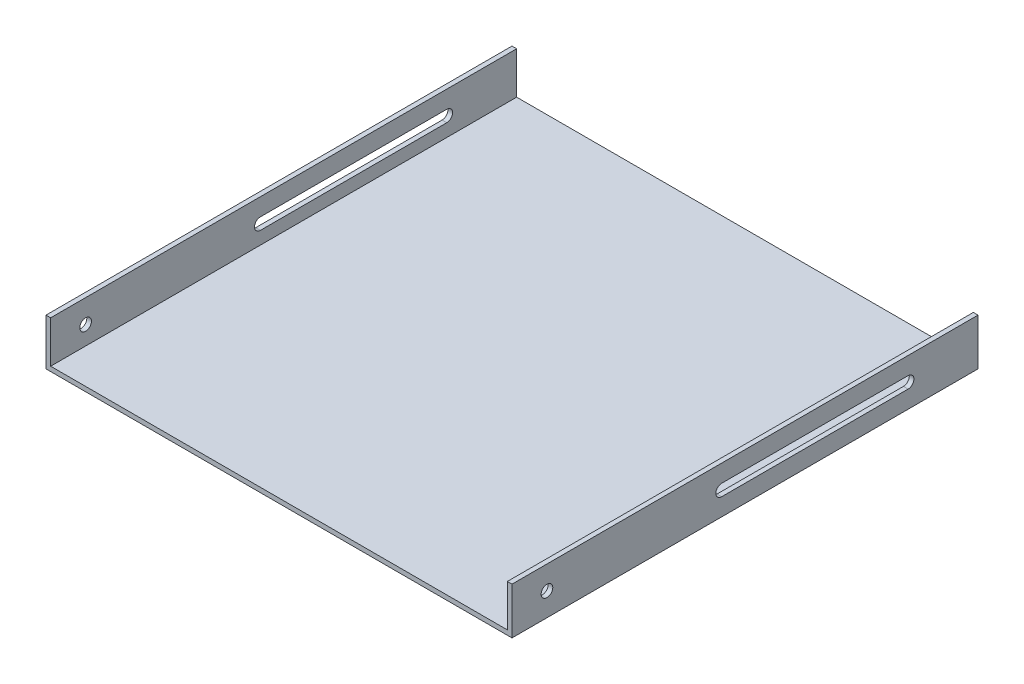
ISO-10303-21;
HEADER;
FILE_DESCRIPTION(('STEP AP214'),'2;1');
FILE_NAME('part.step','',(''),(''),'','','');
FILE_SCHEMA(('AUTOMOTIVE_DESIGN { 1 0 10303 214 1 1 1 1 }'));
ENDSEC;
DATA;
#1=APPLICATION_CONTEXT('core data for automotive mechanical design processes');
#2=APPLICATION_PROTOCOL_DEFINITION('international standard','automotive_design',2000,#1);
#3=PRODUCT_CONTEXT('',#1,'mechanical');
#4=PRODUCT('Part','Part','',(#3));
#5=PRODUCT_RELATED_PRODUCT_CATEGORY('part','',(#4));
#6=PRODUCT_DEFINITION_FORMATION('','',#4);
#7=PRODUCT_DEFINITION_CONTEXT('part definition',#1,'design');
#8=PRODUCT_DEFINITION('design','',#6,#7);
#9=PRODUCT_DEFINITION_SHAPE('','',#8);
#10=(LENGTH_UNIT() NAMED_UNIT(*) SI_UNIT(.MILLI.,.METRE.));
#11=(NAMED_UNIT(*) PLANE_ANGLE_UNIT() SI_UNIT($,.RADIAN.));
#12=(NAMED_UNIT(*) SI_UNIT($,.STERADIAN.) SOLID_ANGLE_UNIT());
#13=UNCERTAINTY_MEASURE_WITH_UNIT(LENGTH_MEASURE(1.E-05),#10,'distance_accuracy_value','');
#14=(GEOMETRIC_REPRESENTATION_CONTEXT(3) GLOBAL_UNCERTAINTY_ASSIGNED_CONTEXT((#13)) GLOBAL_UNIT_ASSIGNED_CONTEXT((#10,
#11,#12)) REPRESENTATION_CONTEXT('',''));
#15=CARTESIAN_POINT('',(0.,0.,0.));
#16=DIRECTION('',(0.,0.,1.));
#17=DIRECTION('',(1.,0.,0.));
#18=AXIS2_PLACEMENT_3D('',#15,#16,#17);
#19=CARTESIAN_POINT('',(2.,20.,100.));
#20=DIRECTION('',(0.,-1.,0.));
#21=DIRECTION('',(0.,0.,-1.));
#22=AXIS2_PLACEMENT_3D('',#19,#20,#21);
#23=PLANE('',#22);
#24=DIRECTION('',(-1.,0.,0.));
#25=VECTOR('',#24,1.);
#26=CARTESIAN_POINT('',(2.,20.,-100.));
#27=LINE('',#26,#25);
#28=CARTESIAN_POINT('',(2.,20.,-100.));
#29=VERTEX_POINT('',#28);
#30=CARTESIAN_POINT('',(0.,20.,-100.));
#31=VERTEX_POINT('',#30);
#32=EDGE_CURVE('E235',#29,#31,#27,.T.);
#33=ORIENTED_EDGE('',*,*,#32,.T.);
#34=DIRECTION('',(0.,0.,-1.));
#35=VECTOR('',#34,1.);
#36=CARTESIAN_POINT('',(0.,20.,100.));
#37=LINE('',#36,#35);
#38=CARTESIAN_POINT('',(0.,20.,100.));
#39=VERTEX_POINT('',#38);
#40=EDGE_CURVE('E313',#39,#31,#37,.T.);
#41=ORIENTED_EDGE('',*,*,#40,.F.);
#42=DIRECTION('',(-1.,0.,0.));
#43=VECTOR('',#42,1.);
#44=CARTESIAN_POINT('',(2.,20.,100.));
#45=LINE('',#44,#43);
#46=CARTESIAN_POINT('',(2.,20.,100.));
#47=VERTEX_POINT('',#46);
#48=EDGE_CURVE('E236',#47,#39,#45,.T.);
#49=ORIENTED_EDGE('',*,*,#48,.F.);
#50=DIRECTION('',(0.,0.,-1.));
#51=VECTOR('',#50,1.);
#52=CARTESIAN_POINT('',(2.,20.,100.));
#53=LINE('',#52,#51);
#54=EDGE_CURVE('E262',#47,#29,#53,.T.);
#55=ORIENTED_EDGE('',*,*,#54,.T.);
#56=EDGE_LOOP('',(#33,#41,#49,#55));
#57=FACE_BOUND('',#56,.T.);
#58=ADVANCED_FACE('F39',(#57),#23,.F.);
#59=CARTESIAN_POINT('',(0.,20.,100.));
#60=DIRECTION('',(1.,0.,0.));
#61=DIRECTION('',(0.,1.,0.));
#62=AXIS2_PLACEMENT_3D('',#59,#60,#61);
#63=PLANE('',#62);
#64=CARTESIAN_POINT('',(0.,10.,85.));
#65=DIRECTION('',(1.,0.,0.));
#66=DIRECTION('',(0.,0.,-1.));
#67=AXIS2_PLACEMENT_3D('',#64,#65,#66);
#68=CIRCLE('',#67,2.50000000000001);
#69=CARTESIAN_POINT('',(0.,10.,82.5));
#70=VERTEX_POINT('',#69);
#71=EDGE_CURVE('E219',#70,#70,#68,.T.);
#72=ORIENTED_EDGE('',*,*,#71,.T.);
#73=EDGE_LOOP('',(#72));
#74=FACE_BOUND('',#73,.T.);
#75=DIRECTION('',(0.,0.,-1.));
#76=VECTOR('',#75,1.);
#77=CARTESIAN_POINT('',(0.,7.50000000000003,-70.));
#78=LINE('',#77,#76);
#79=CARTESIAN_POINT('',(0.,7.50000000000002,9.99999999999999));
#80=VERTEX_POINT('',#79);
#81=CARTESIAN_POINT('',(0.,7.50000000000003,-70.));
#82=VERTEX_POINT('',#81);
#83=EDGE_CURVE('E178',#80,#82,#78,.T.);
#84=ORIENTED_EDGE('',*,*,#83,.T.);
#85=CARTESIAN_POINT('',(0.,10.,-70.));
#86=DIRECTION('',(1.,0.,0.));
#87=DIRECTION('',(0.,0.,-1.));
#88=AXIS2_PLACEMENT_3D('',#85,#86,#87);
#89=CIRCLE('',#88,2.5);
#90=CARTESIAN_POINT('',(0.,12.5,-70.));
#91=VERTEX_POINT('',#90);
#92=EDGE_CURVE('E160',#82,#91,#89,.T.);
#93=ORIENTED_EDGE('',*,*,#92,.T.);
#94=DIRECTION('',(0.,0.,1.));
#95=VECTOR('',#94,1.);
#96=CARTESIAN_POINT('',(0.,12.5,-70.));
#97=LINE('',#96,#95);
#98=CARTESIAN_POINT('',(0.,12.5,9.99999999999999));
#99=VERTEX_POINT('',#98);
#100=EDGE_CURVE('E169',#91,#99,#97,.T.);
#101=ORIENTED_EDGE('',*,*,#100,.T.);
#102=CARTESIAN_POINT('',(0.,10.,9.99999999999999));
#103=DIRECTION('',(1.,0.,0.));
#104=DIRECTION('',(0.,0.,-1.));
#105=AXIS2_PLACEMENT_3D('',#102,#103,#104);
#106=CIRCLE('',#105,2.5);
#107=EDGE_CURVE('E55',#99,#80,#106,.T.);
#108=ORIENTED_EDGE('',*,*,#107,.T.);
#109=EDGE_LOOP('',(#84,#93,#101,#108));
#110=FACE_BOUND('',#109,.T.);
#111=DIRECTION('',(0.,-1.,0.));
#112=VECTOR('',#111,1.);
#113=CARTESIAN_POINT('',(0.,20.,-100.));
#114=LINE('',#113,#112);
#115=CARTESIAN_POINT('',(0.,0.,-100.));
#116=VERTEX_POINT('',#115);
#117=EDGE_CURVE('E266',#31,#116,#114,.T.);
#118=ORIENTED_EDGE('',*,*,#117,.T.);
#119=DIRECTION('',(0.,0.,-1.));
#120=VECTOR('',#119,1.);
#121=CARTESIAN_POINT('',(0.,0.,100.));
#122=LINE('',#121,#120);
#123=CARTESIAN_POINT('',(0.,0.,100.));
#124=VERTEX_POINT('',#123);
#125=EDGE_CURVE('E309',#124,#116,#122,.T.);
#126=ORIENTED_EDGE('',*,*,#125,.F.);
#127=DIRECTION('',(0.,-1.,0.));
#128=VECTOR('',#127,1.);
#129=CARTESIAN_POINT('',(0.,20.,100.));
#130=LINE('',#129,#128);
#131=EDGE_CURVE('E240',#39,#124,#130,.T.);
#132=ORIENTED_EDGE('',*,*,#131,.F.);
#133=ORIENTED_EDGE('',*,*,#40,.T.);
#134=EDGE_LOOP('',(#118,#126,#132,#133));
#135=FACE_BOUND('',#134,.T.);
#136=ADVANCED_FACE('F175',(#74,#110,#135),#63,.F.);
#137=CARTESIAN_POINT('',(0.,0.,100.));
#138=DIRECTION('',(0.,1.,0.));
#139=DIRECTION('',(0.,0.,1.));
#140=AXIS2_PLACEMENT_3D('',#137,#138,#139);
#141=PLANE('',#140);
#142=DIRECTION('',(1.,0.,0.));
#143=VECTOR('',#142,1.);
#144=CARTESIAN_POINT('',(0.,0.,-100.));
#145=LINE('',#144,#143);
#146=CARTESIAN_POINT('',(200.,0.,-100.));
#147=VERTEX_POINT('',#146);
#148=EDGE_CURVE('E269',#116,#147,#145,.T.);
#149=ORIENTED_EDGE('',*,*,#148,.T.);
#150=DIRECTION('',(0.,0.,-1.));
#151=VECTOR('',#150,1.);
#152=CARTESIAN_POINT('',(200.,0.,100.));
#153=LINE('',#152,#151);
#154=CARTESIAN_POINT('',(200.,0.,100.));
#155=VERTEX_POINT('',#154);
#156=EDGE_CURVE('E305',#155,#147,#153,.T.);
#157=ORIENTED_EDGE('',*,*,#156,.F.);
#158=DIRECTION('',(1.,0.,0.));
#159=VECTOR('',#158,1.);
#160=CARTESIAN_POINT('',(0.,0.,100.));
#161=LINE('',#160,#159);
#162=EDGE_CURVE('E244',#124,#155,#161,.T.);
#163=ORIENTED_EDGE('',*,*,#162,.F.);
#164=ORIENTED_EDGE('',*,*,#125,.T.);
#165=EDGE_LOOP('',(#149,#157,#163,#164));
#166=FACE_BOUND('',#165,.T.);
#167=ADVANCED_FACE('F351',(#166),#141,.F.);
#168=CARTESIAN_POINT('',(200.,0.,100.));
#169=DIRECTION('',(-1.,0.,0.));
#170=DIRECTION('',(0.,0.,1.));
#171=AXIS2_PLACEMENT_3D('',#168,#169,#170);
#172=PLANE('',#171);
#173=CARTESIAN_POINT('',(200.,10.,85.));
#174=DIRECTION('',(1.,0.,0.));
#175=DIRECTION('',(0.,0.,-1.));
#176=AXIS2_PLACEMENT_3D('',#173,#174,#175);
#177=CIRCLE('',#176,2.50000000000001);
#178=CARTESIAN_POINT('',(200.,10.,82.5));
#179=VERTEX_POINT('',#178);
#180=EDGE_CURVE('E187',#179,#179,#177,.T.);
#181=ORIENTED_EDGE('',*,*,#180,.F.);
#182=EDGE_LOOP('',(#181));
#183=FACE_BOUND('',#182,.T.);
#184=DIRECTION('',(0.,0.,1.));
#185=VECTOR('',#184,1.);
#186=CARTESIAN_POINT('',(200.,12.5,-70.));
#187=LINE('',#186,#185);
#188=CARTESIAN_POINT('',(200.,12.5,-70.));
#189=VERTEX_POINT('',#188);
#190=CARTESIAN_POINT('',(200.,12.5,9.99999999999999));
#191=VERTEX_POINT('',#190);
#192=EDGE_CURVE('E196',#189,#191,#187,.T.);
#193=ORIENTED_EDGE('',*,*,#192,.F.);
#194=CARTESIAN_POINT('',(200.,10.,-70.));
#195=DIRECTION('',(1.,0.,0.));
#196=DIRECTION('',(0.,0.,-1.));
#197=AXIS2_PLACEMENT_3D('',#194,#195,#196);
#198=CIRCLE('',#197,2.5);
#199=CARTESIAN_POINT('',(200.,7.50000000000003,-70.));
#200=VERTEX_POINT('',#199);
#201=EDGE_CURVE('E63',#200,#189,#198,.T.);
#202=ORIENTED_EDGE('',*,*,#201,.F.);
#203=DIRECTION('',(0.,0.,-1.));
#204=VECTOR('',#203,1.);
#205=CARTESIAN_POINT('',(200.,7.50000000000003,-70.));
#206=LINE('',#205,#204);
#207=CARTESIAN_POINT('',(200.,7.50000000000002,9.99999999999999));
#208=VERTEX_POINT('',#207);
#209=EDGE_CURVE('E180',#208,#200,#206,.T.);
#210=ORIENTED_EDGE('',*,*,#209,.F.);
#211=CARTESIAN_POINT('',(200.,10.,9.99999999999999));
#212=DIRECTION('',(1.,0.,0.));
#213=DIRECTION('',(0.,0.,-1.));
#214=AXIS2_PLACEMENT_3D('',#211,#212,#213);
#215=CIRCLE('',#214,2.5);
#216=EDGE_CURVE('E184',#191,#208,#215,.T.);
#217=ORIENTED_EDGE('',*,*,#216,.F.);
#218=EDGE_LOOP('',(#193,#202,#210,#217));
#219=FACE_BOUND('',#218,.T.);
#220=DIRECTION('',(0.,1.,0.));
#221=VECTOR('',#220,1.);
#222=CARTESIAN_POINT('',(200.,0.,-100.));
#223=LINE('',#222,#221);
#224=CARTESIAN_POINT('',(200.,20.,-100.));
#225=VERTEX_POINT('',#224);
#226=EDGE_CURVE('E272',#147,#225,#223,.T.);
#227=ORIENTED_EDGE('',*,*,#226,.T.);
#228=DIRECTION('',(0.,0.,-1.));
#229=VECTOR('',#228,1.);
#230=CARTESIAN_POINT('',(200.,20.,100.));
#231=LINE('',#230,#229);
#232=CARTESIAN_POINT('',(200.,20.,100.));
#233=VERTEX_POINT('',#232);
#234=EDGE_CURVE('E301',#233,#225,#231,.T.);
#235=ORIENTED_EDGE('',*,*,#234,.F.);
#236=DIRECTION('',(0.,1.,0.));
#237=VECTOR('',#236,1.);
#238=CARTESIAN_POINT('',(200.,0.,100.));
#239=LINE('',#238,#237);
#240=EDGE_CURVE('E247',#155,#233,#239,.T.);
#241=ORIENTED_EDGE('',*,*,#240,.F.);
#242=ORIENTED_EDGE('',*,*,#156,.T.);
#243=EDGE_LOOP('',(#227,#235,#241,#242));
#244=FACE_BOUND('',#243,.T.);
#245=ADVANCED_FACE('F384',(#183,#219,#244),#172,.F.);
#246=CARTESIAN_POINT('',(200.,20.,100.));
#247=DIRECTION('',(0.,-1.,0.));
#248=DIRECTION('',(1.,0.,0.));
#249=AXIS2_PLACEMENT_3D('',#246,#247,#248);
#250=PLANE('',#249);
#251=DIRECTION('',(-1.,0.,0.));
#252=VECTOR('',#251,1.);
#253=CARTESIAN_POINT('',(200.,20.,-100.));
#254=LINE('',#253,#252);
#255=CARTESIAN_POINT('',(198.,20.,-100.));
#256=VERTEX_POINT('',#255);
#257=EDGE_CURVE('E275',#225,#256,#254,.T.);
#258=ORIENTED_EDGE('',*,*,#257,.T.);
#259=DIRECTION('',(0.,0.,-1.));
#260=VECTOR('',#259,1.);
#261=CARTESIAN_POINT('',(198.,20.,100.));
#262=LINE('',#261,#260);
#263=CARTESIAN_POINT('',(198.,20.,100.));
#264=VERTEX_POINT('',#263);
#265=EDGE_CURVE('E297',#264,#256,#262,.T.);
#266=ORIENTED_EDGE('',*,*,#265,.F.);
#267=DIRECTION('',(-1.,0.,0.));
#268=VECTOR('',#267,1.);
#269=CARTESIAN_POINT('',(200.,20.,100.));
#270=LINE('',#269,#268);
#271=EDGE_CURVE('E250',#233,#264,#270,.T.);
#272=ORIENTED_EDGE('',*,*,#271,.F.);
#273=ORIENTED_EDGE('',*,*,#234,.T.);
#274=EDGE_LOOP('',(#258,#266,#272,#273));
#275=FACE_BOUND('',#274,.T.);
#276=ADVANCED_FACE('F380',(#275),#250,.F.);
#277=CARTESIAN_POINT('',(198.,20.,100.));
#278=DIRECTION('',(1.,0.,0.));
#279=DIRECTION('',(0.,0.,-1.));
#280=AXIS2_PLACEMENT_3D('',#277,#278,#279);
#281=PLANE('',#280);
#282=CARTESIAN_POINT('',(198.,10.,85.));
#283=DIRECTION('',(1.,0.,0.));
#284=DIRECTION('',(0.,0.,-1.));
#285=AXIS2_PLACEMENT_3D('',#282,#283,#284);
#286=CIRCLE('',#285,2.50000000000001);
#287=CARTESIAN_POINT('',(198.,10.,82.5));
#288=VERTEX_POINT('',#287);
#289=EDGE_CURVE('E231',#288,#288,#286,.T.);
#290=ORIENTED_EDGE('',*,*,#289,.T.);
#291=EDGE_LOOP('',(#290));
#292=FACE_BOUND('',#291,.T.);
#293=DIRECTION('',(0.,0.,-1.));
#294=VECTOR('',#293,1.);
#295=CARTESIAN_POINT('',(198.,7.50000000000001,100.));
#296=LINE('',#295,#294);
#297=CARTESIAN_POINT('',(198.,7.50000000000002,9.99999999999999));
#298=VERTEX_POINT('',#297);
#299=CARTESIAN_POINT('',(198.,7.50000000000003,-70.));
#300=VERTEX_POINT('',#299);
#301=EDGE_CURVE('E223',#298,#300,#296,.T.);
#302=ORIENTED_EDGE('',*,*,#301,.T.);
#303=CARTESIAN_POINT('',(198.,10.,-70.));
#304=DIRECTION('',(1.,0.,0.));
#305=DIRECTION('',(0.,0.,-1.));
#306=AXIS2_PLACEMENT_3D('',#303,#304,#305);
#307=CIRCLE('',#306,2.5);
#308=CARTESIAN_POINT('',(198.,12.5,-70.));
#309=VERTEX_POINT('',#308);
#310=EDGE_CURVE('E227',#300,#309,#307,.T.);
#311=ORIENTED_EDGE('',*,*,#310,.T.);
#312=DIRECTION('',(0.,0.,1.));
#313=VECTOR('',#312,1.);
#314=CARTESIAN_POINT('',(198.,12.5,100.));
#315=LINE('',#314,#313);
#316=CARTESIAN_POINT('',(198.,12.5,9.99999999999999));
#317=VERTEX_POINT('',#316);
#318=EDGE_CURVE('E214',#309,#317,#315,.T.);
#319=ORIENTED_EDGE('',*,*,#318,.T.);
#320=CARTESIAN_POINT('',(198.,10.,9.99999999999999));
#321=DIRECTION('',(1.,0.,0.));
#322=DIRECTION('',(0.,0.,-1.));
#323=AXIS2_PLACEMENT_3D('',#320,#321,#322);
#324=CIRCLE('',#323,2.5);
#325=EDGE_CURVE('E218',#317,#298,#324,.T.);
#326=ORIENTED_EDGE('',*,*,#325,.T.);
#327=EDGE_LOOP('',(#302,#311,#319,#326));
#328=FACE_BOUND('',#327,.T.);
#329=DIRECTION('',(0.,-1.,0.));
#330=VECTOR('',#329,1.);
#331=CARTESIAN_POINT('',(198.,20.,-100.));
#332=LINE('',#331,#330);
#333=CARTESIAN_POINT('',(198.,2.,-100.));
#334=VERTEX_POINT('',#333);
#335=EDGE_CURVE('E278',#256,#334,#332,.T.);
#336=ORIENTED_EDGE('',*,*,#335,.T.);
#337=DIRECTION('',(0.,0.,-1.));
#338=VECTOR('',#337,1.);
#339=CARTESIAN_POINT('',(198.,2.,100.));
#340=LINE('',#339,#338);
#341=CARTESIAN_POINT('',(198.,2.,100.));
#342=VERTEX_POINT('',#341);
#343=EDGE_CURVE('E293',#342,#334,#340,.T.);
#344=ORIENTED_EDGE('',*,*,#343,.F.);
#345=DIRECTION('',(0.,-1.,0.));
#346=VECTOR('',#345,1.);
#347=CARTESIAN_POINT('',(198.,20.,100.));
#348=LINE('',#347,#346);
#349=EDGE_CURVE('E253',#264,#342,#348,.T.);
#350=ORIENTED_EDGE('',*,*,#349,.F.);
#351=ORIENTED_EDGE('',*,*,#265,.T.);
#352=EDGE_LOOP('',(#336,#344,#350,#351));
#353=FACE_BOUND('',#352,.T.);
#354=ADVANCED_FACE('F375',(#292,#328,#353),#281,.F.);
#355=CARTESIAN_POINT('',(198.,2.,100.));
#356=DIRECTION('',(0.,-1.,0.));
#357=DIRECTION('',(1.,0.,0.));
#358=AXIS2_PLACEMENT_3D('',#355,#356,#357);
#359=PLANE('',#358);
#360=DIRECTION('',(-1.,0.,0.));
#361=VECTOR('',#360,1.);
#362=CARTESIAN_POINT('',(198.,2.,-100.));
#363=LINE('',#362,#361);
#364=CARTESIAN_POINT('',(2.,1.99999999999998,-100.));
#365=VERTEX_POINT('',#364);
#366=EDGE_CURVE('E281',#334,#365,#363,.T.);
#367=ORIENTED_EDGE('',*,*,#366,.T.);
#368=DIRECTION('',(0.,0.,-1.));
#369=VECTOR('',#368,1.);
#370=CARTESIAN_POINT('',(2.,1.99999999999998,100.));
#371=LINE('',#370,#369);
#372=CARTESIAN_POINT('',(2.,1.99999999999998,100.));
#373=VERTEX_POINT('',#372);
#374=EDGE_CURVE('E289',#373,#365,#371,.T.);
#375=ORIENTED_EDGE('',*,*,#374,.F.);
#376=DIRECTION('',(-1.,0.,0.));
#377=VECTOR('',#376,1.);
#378=CARTESIAN_POINT('',(198.,2.,100.));
#379=LINE('',#378,#377);
#380=EDGE_CURVE('E256',#342,#373,#379,.T.);
#381=ORIENTED_EDGE('',*,*,#380,.F.);
#382=ORIENTED_EDGE('',*,*,#343,.T.);
#383=EDGE_LOOP('',(#367,#375,#381,#382));
#384=FACE_BOUND('',#383,.T.);
#385=ADVANCED_FACE('F370',(#384),#359,.F.);
#386=CARTESIAN_POINT('',(2.,1.99999999999998,100.));
#387=DIRECTION('',(-1.,0.,0.));
#388=DIRECTION('',(0.,-1.,0.));
#389=AXIS2_PLACEMENT_3D('',#386,#387,#388);
#390=PLANE('',#389);
#391=CARTESIAN_POINT('',(2.,10.,85.));
#392=DIRECTION('',(-1.,0.,0.));
#393=DIRECTION('',(0.,-1.,0.));
#394=AXIS2_PLACEMENT_3D('',#391,#392,#393);
#395=CIRCLE('',#394,2.50000000000001);
#396=CARTESIAN_POINT('',(2.,7.5,85.));
#397=VERTEX_POINT('',#396);
#398=EDGE_CURVE('E42',#397,#397,#395,.T.);
#399=ORIENTED_EDGE('',*,*,#398,.T.);
#400=EDGE_LOOP('',(#399));
#401=FACE_BOUND('',#400,.T.);
#402=DIRECTION('',(0.,0.,-1.));
#403=VECTOR('',#402,1.);
#404=CARTESIAN_POINT('',(2.,12.5,100.));
#405=LINE('',#404,#403);
#406=CARTESIAN_POINT('',(2.,12.5,9.99999999999999));
#407=VERTEX_POINT('',#406);
#408=CARTESIAN_POINT('',(2.,12.5,-70.));
#409=VERTEX_POINT('',#408);
#410=EDGE_CURVE('E317',#407,#409,#405,.T.);
#411=ORIENTED_EDGE('',*,*,#410,.T.);
#412=CARTESIAN_POINT('',(2.,10.,-70.));
#413=DIRECTION('',(-1.,0.,0.));
#414=DIRECTION('',(0.,-1.,0.));
#415=AXIS2_PLACEMENT_3D('',#412,#413,#414);
#416=CIRCLE('',#415,2.5);
#417=CARTESIAN_POINT('',(2.,7.50000000000003,-70.));
#418=VERTEX_POINT('',#417);
#419=EDGE_CURVE('E11',#409,#418,#416,.T.);
#420=ORIENTED_EDGE('',*,*,#419,.T.);
#421=DIRECTION('',(0.,0.,1.));
#422=VECTOR('',#421,1.);
#423=CARTESIAN_POINT('',(2.,7.50000000000001,100.));
#424=LINE('',#423,#422);
#425=CARTESIAN_POINT('',(2.,7.50000000000002,9.99999999999999));
#426=VERTEX_POINT('',#425);
#427=EDGE_CURVE('E48',#418,#426,#424,.T.);
#428=ORIENTED_EDGE('',*,*,#427,.T.);
#429=CARTESIAN_POINT('',(2.,10.,9.99999999999999));
#430=DIRECTION('',(-1.,0.,0.));
#431=DIRECTION('',(0.,-1.,0.));
#432=AXIS2_PLACEMENT_3D('',#429,#430,#431);
#433=CIRCLE('',#432,2.5);
#434=EDGE_CURVE('E320',#426,#407,#433,.T.);
#435=ORIENTED_EDGE('',*,*,#434,.T.);
#436=EDGE_LOOP('',(#411,#420,#428,#435));
#437=FACE_BOUND('',#436,.T.);
#438=DIRECTION('',(0.,1.,0.));
#439=VECTOR('',#438,1.);
#440=CARTESIAN_POINT('',(2.,1.99999999999998,-100.));
#441=LINE('',#440,#439);
#442=EDGE_CURVE('E241',#365,#29,#441,.T.);
#443=ORIENTED_EDGE('',*,*,#442,.T.);
#444=ORIENTED_EDGE('',*,*,#54,.F.);
#445=DIRECTION('',(0.,1.,0.));
#446=VECTOR('',#445,1.);
#447=CARTESIAN_POINT('',(2.,1.99999999999998,100.));
#448=LINE('',#447,#446);
#449=EDGE_CURVE('E259',#373,#47,#448,.T.);
#450=ORIENTED_EDGE('',*,*,#449,.F.);
#451=ORIENTED_EDGE('',*,*,#374,.T.);
#452=EDGE_LOOP('',(#443,#444,#450,#451));
#453=FACE_BOUND('',#452,.T.);
#454=ADVANCED_FACE('F327',(#401,#437,#453),#390,.F.);
#455=CARTESIAN_POINT('',(0.,0.,100.));
#456=DIRECTION('',(0.,0.,1.));
#457=DIRECTION('',(1.,0.,0.));
#458=AXIS2_PLACEMENT_3D('',#455,#456,#457);
#459=PLANE('',#458);
#460=ORIENTED_EDGE('',*,*,#48,.T.);
#461=ORIENTED_EDGE('',*,*,#131,.T.);
#462=ORIENTED_EDGE('',*,*,#162,.T.);
#463=ORIENTED_EDGE('',*,*,#240,.T.);
#464=ORIENTED_EDGE('',*,*,#271,.T.);
#465=ORIENTED_EDGE('',*,*,#349,.T.);
#466=ORIENTED_EDGE('',*,*,#380,.T.);
#467=ORIENTED_EDGE('',*,*,#449,.T.);
#468=EDGE_LOOP('',(#460,#461,#462,#463,#464,#465,#466,#467));
#469=FACE_BOUND('',#468,.T.);
#470=ADVANCED_FACE('F365',(#469),#459,.T.);
#471=CARTESIAN_POINT('',(0.,0.,-100.));
#472=DIRECTION('',(0.,0.,1.));
#473=DIRECTION('',(1.,0.,0.));
#474=AXIS2_PLACEMENT_3D('',#471,#472,#473);
#475=PLANE('',#474);
#476=ORIENTED_EDGE('',*,*,#32,.F.);
#477=ORIENTED_EDGE('',*,*,#442,.F.);
#478=ORIENTED_EDGE('',*,*,#366,.F.);
#479=ORIENTED_EDGE('',*,*,#335,.F.);
#480=ORIENTED_EDGE('',*,*,#257,.F.);
#481=ORIENTED_EDGE('',*,*,#226,.F.);
#482=ORIENTED_EDGE('',*,*,#148,.F.);
#483=ORIENTED_EDGE('',*,*,#117,.F.);
#484=EDGE_LOOP('',(#476,#477,#478,#479,#480,#481,#482,#483));
#485=FACE_BOUND('',#484,.T.);
#486=ADVANCED_FACE('F341',(#485),#475,.F.);
#487=CARTESIAN_POINT('',(0.,12.5,-70.));
#488=DIRECTION('',(0.,1.,0.));
#489=DIRECTION('',(0.,0.,1.));
#490=AXIS2_PLACEMENT_3D('',#487,#488,#489);
#491=PLANE('',#490);
#492=DIRECTION('',(1.,0.,0.));
#493=VECTOR('',#492,1.);
#494=CARTESIAN_POINT('',(0.,12.5,9.99999999999999));
#495=LINE('',#494,#493);
#496=EDGE_CURVE('E171',#99,#407,#495,.T.);
#497=ORIENTED_EDGE('',*,*,#496,.F.);
#498=ORIENTED_EDGE('',*,*,#100,.F.);
#499=DIRECTION('',(1.,0.,0.));
#500=VECTOR('',#499,1.);
#501=CARTESIAN_POINT('',(0.,12.5,-70.));
#502=LINE('',#501,#500);
#503=EDGE_CURVE('E155',#91,#409,#502,.T.);
#504=ORIENTED_EDGE('',*,*,#503,.T.);
#505=ORIENTED_EDGE('',*,*,#410,.F.);
#506=EDGE_LOOP('',(#497,#498,#504,#505));
#507=FACE_BOUND('',#506,.T.);
#508=ADVANCED_FACE('F170',(#507),#491,.F.);
#509=CARTESIAN_POINT('',(0.,10.,9.99999999999999));
#510=DIRECTION('',(1.,0.,0.));
#511=DIRECTION('',(0.,0.,-1.));
#512=AXIS2_PLACEMENT_3D('',#509,#510,#511);
#513=CYLINDRICAL_SURFACE('',#512,2.5);
#514=DIRECTION('',(1.,0.,0.));
#515=VECTOR('',#514,1.);
#516=CARTESIAN_POINT('',(0.,7.50000000000002,9.99999999999999));
#517=LINE('',#516,#515);
#518=EDGE_CURVE('E207',#80,#426,#517,.T.);
#519=ORIENTED_EDGE('',*,*,#518,.F.);
#520=ORIENTED_EDGE('',*,*,#107,.F.);
#521=ORIENTED_EDGE('',*,*,#496,.T.);
#522=ORIENTED_EDGE('',*,*,#434,.F.);
#523=EDGE_LOOP('',(#519,#520,#521,#522));
#524=FACE_BOUND('',#523,.T.);
#525=ADVANCED_FACE('F331',(#524),#513,.F.);
#526=CARTESIAN_POINT('',(0.,7.50000000000003,-70.));
#527=DIRECTION('',(0.,-1.,0.));
#528=DIRECTION('',(0.,0.,-1.));
#529=AXIS2_PLACEMENT_3D('',#526,#527,#528);
#530=PLANE('',#529);
#531=DIRECTION('',(1.,0.,0.));
#532=VECTOR('',#531,1.);
#533=CARTESIAN_POINT('',(0.,7.50000000000003,-70.));
#534=LINE('',#533,#532);
#535=EDGE_CURVE('E203',#82,#418,#534,.T.);
#536=ORIENTED_EDGE('',*,*,#535,.F.);
#537=ORIENTED_EDGE('',*,*,#83,.F.);
#538=ORIENTED_EDGE('',*,*,#518,.T.);
#539=ORIENTED_EDGE('',*,*,#427,.F.);
#540=EDGE_LOOP('',(#536,#537,#538,#539));
#541=FACE_BOUND('',#540,.T.);
#542=ADVANCED_FACE('F330',(#541),#530,.F.);
#543=CARTESIAN_POINT('',(0.,10.,-70.));
#544=DIRECTION('',(1.,0.,0.));
#545=DIRECTION('',(0.,0.,-1.));
#546=AXIS2_PLACEMENT_3D('',#543,#544,#545);
#547=CYLINDRICAL_SURFACE('',#546,2.5);
#548=ORIENTED_EDGE('',*,*,#503,.F.);
#549=ORIENTED_EDGE('',*,*,#92,.F.);
#550=ORIENTED_EDGE('',*,*,#535,.T.);
#551=ORIENTED_EDGE('',*,*,#419,.F.);
#552=EDGE_LOOP('',(#548,#549,#550,#551));
#553=FACE_BOUND('',#552,.T.);
#554=ADVANCED_FACE('F157',(#553),#547,.F.);
#555=CARTESIAN_POINT('',(0.,10.,85.));
#556=DIRECTION('',(1.,0.,0.));
#557=DIRECTION('',(0.,0.,-1.));
#558=AXIS2_PLACEMENT_3D('',#555,#556,#557);
#559=CYLINDRICAL_SURFACE('',#558,2.50000000000001);
#560=ORIENTED_EDGE('',*,*,#71,.F.);
#561=EDGE_LOOP('',(#560));
#562=FACE_BOUND('',#561,.T.);
#563=ORIENTED_EDGE('',*,*,#398,.F.);
#564=EDGE_LOOP('',(#563));
#565=FACE_BOUND('',#564,.T.);
#566=ADVANCED_FACE('F411',(#562,#565),#559,.F.);
#567=EDGE_CURVE('E206',#300,#200,#534,.T.);
#568=ORIENTED_EDGE('',*,*,#567,.T.);
#569=ORIENTED_EDGE('',*,*,#201,.T.);
#570=EDGE_CURVE('E166',#309,#189,#502,.T.);
#571=ORIENTED_EDGE('',*,*,#570,.F.);
#572=ORIENTED_EDGE('',*,*,#310,.F.);
#573=EDGE_LOOP('',(#568,#569,#571,#572));
#574=FACE_BOUND('',#573,.T.);
#575=ADVANCED_FACE('F409',(#574),#547,.F.);
#576=EDGE_CURVE('E211',#298,#208,#517,.T.);
#577=ORIENTED_EDGE('',*,*,#576,.T.);
#578=ORIENTED_EDGE('',*,*,#209,.T.);
#579=ORIENTED_EDGE('',*,*,#567,.F.);
#580=ORIENTED_EDGE('',*,*,#301,.F.);
#581=EDGE_LOOP('',(#577,#578,#579,#580));
#582=FACE_BOUND('',#581,.T.);
#583=ADVANCED_FACE('F340',(#582),#530,.F.);
#584=EDGE_CURVE('E165',#317,#191,#495,.T.);
#585=ORIENTED_EDGE('',*,*,#584,.T.);
#586=ORIENTED_EDGE('',*,*,#216,.T.);
#587=ORIENTED_EDGE('',*,*,#576,.F.);
#588=ORIENTED_EDGE('',*,*,#325,.F.);
#589=EDGE_LOOP('',(#585,#586,#587,#588));
#590=FACE_BOUND('',#589,.T.);
#591=ADVANCED_FACE('F334',(#590),#513,.F.);
#592=ORIENTED_EDGE('',*,*,#570,.T.);
#593=ORIENTED_EDGE('',*,*,#192,.T.);
#594=ORIENTED_EDGE('',*,*,#584,.F.);
#595=ORIENTED_EDGE('',*,*,#318,.F.);
#596=EDGE_LOOP('',(#592,#593,#594,#595));
#597=FACE_BOUND('',#596,.T.);
#598=ADVANCED_FACE('F343',(#597),#491,.F.);
#599=ORIENTED_EDGE('',*,*,#180,.T.);
#600=EDGE_LOOP('',(#599));
#601=FACE_BOUND('',#600,.T.);
#602=ORIENTED_EDGE('',*,*,#289,.F.);
#603=EDGE_LOOP('',(#602));
#604=FACE_BOUND('',#603,.T.);
#605=ADVANCED_FACE('F413',(#601,#604),#559,.F.);
#606=CLOSED_SHELL('',(#58,#136,#167,#245,#276,#354,#385,#454,#470,#486,#508,#525,#542,#554,#566,
#575,#583,#591,#598,#605));
#607=MANIFOLD_SOLID_BREP('B2',#606);
#608=ADVANCED_BREP_SHAPE_REPRESENTATION('',(#18,#607),#14);
#609=SHAPE_DEFINITION_REPRESENTATION(#9,#608);
ENDSEC;
END-ISO-10303-21;
